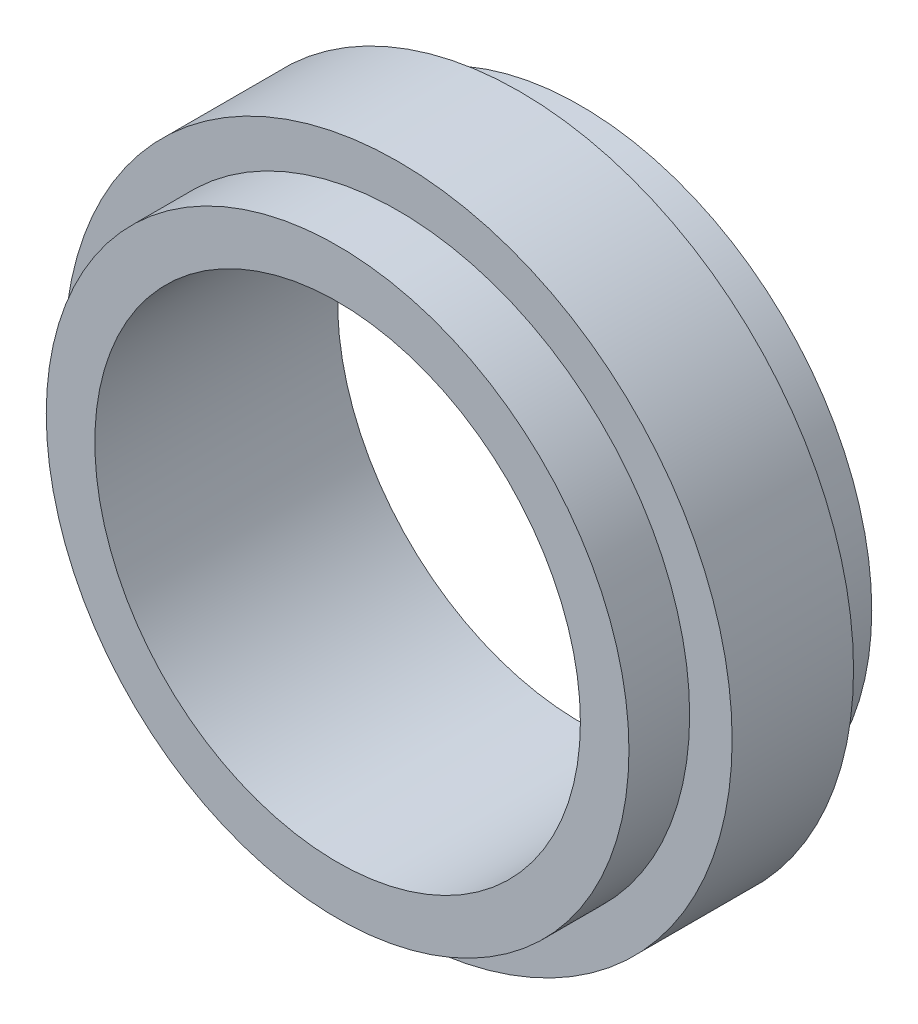
ISO-10303-21;
HEADER;
FILE_DESCRIPTION(('STEP AP214'),'2;1');
FILE_NAME('part.step','',(''),(''),'','','');
FILE_SCHEMA(('AUTOMOTIVE_DESIGN { 1 0 10303 214 1 1 1 1 }'));
ENDSEC;
DATA;
#1=APPLICATION_CONTEXT('core data for automotive mechanical design processes');
#2=APPLICATION_PROTOCOL_DEFINITION('international standard','automotive_design',2000,#1);
#3=PRODUCT_CONTEXT('',#1,'mechanical');
#4=PRODUCT('Part','Part','',(#3));
#5=PRODUCT_RELATED_PRODUCT_CATEGORY('part','',(#4));
#6=PRODUCT_DEFINITION_FORMATION('','',#4);
#7=PRODUCT_DEFINITION_CONTEXT('part definition',#1,'design');
#8=PRODUCT_DEFINITION('design','',#6,#7);
#9=PRODUCT_DEFINITION_SHAPE('','',#8);
#10=(LENGTH_UNIT() NAMED_UNIT(*) SI_UNIT(.MILLI.,.METRE.));
#11=(NAMED_UNIT(*) PLANE_ANGLE_UNIT() SI_UNIT($,.RADIAN.));
#12=(NAMED_UNIT(*) SI_UNIT($,.STERADIAN.) SOLID_ANGLE_UNIT());
#13=UNCERTAINTY_MEASURE_WITH_UNIT(LENGTH_MEASURE(1.E-05),#10,'distance_accuracy_value','');
#14=(GEOMETRIC_REPRESENTATION_CONTEXT(3) GLOBAL_UNCERTAINTY_ASSIGNED_CONTEXT((#13)) GLOBAL_UNIT_ASSIGNED_CONTEXT((#10,
#11,#12)) REPRESENTATION_CONTEXT('',''));
#15=CARTESIAN_POINT('',(0.,0.,0.));
#16=DIRECTION('',(0.,0.,1.));
#17=DIRECTION('',(1.,0.,0.));
#18=AXIS2_PLACEMENT_3D('',#15,#16,#17);
#19=CARTESIAN_POINT('',(0.,0.,5.));
#20=DIRECTION('',(0.,0.,1.));
#21=DIRECTION('',(1.,0.,0.));
#22=AXIS2_PLACEMENT_3D('',#19,#20,#21);
#23=PLANE('',#22);
#24=CARTESIAN_POINT('',(0.,0.,5.));
#25=DIRECTION('',(0.,0.,1.));
#26=DIRECTION('',(1.,0.,0.));
#27=AXIS2_PLACEMENT_3D('',#24,#25,#26);
#28=CIRCLE('',#27,27.5);
#29=CARTESIAN_POINT('',(27.5,0.,5.));
#30=VERTEX_POINT('',#29);
#31=EDGE_CURVE('E10',#30,#30,#28,.T.);
#32=ORIENTED_EDGE('',*,*,#31,.T.);
#33=EDGE_LOOP('',(#32));
#34=FACE_BOUND('',#33,.T.);
#35=CARTESIAN_POINT('',(0.,0.,5.));
#36=DIRECTION('',(0.,0.,1.));
#37=DIRECTION('',(1.,0.,0.));
#38=AXIS2_PLACEMENT_3D('',#35,#36,#37);
#39=CIRCLE('',#38,24.);
#40=CARTESIAN_POINT('',(24.,0.,5.));
#41=VERTEX_POINT('',#40);
#42=EDGE_CURVE('E45',#41,#41,#39,.T.);
#43=ORIENTED_EDGE('',*,*,#42,.F.);
#44=EDGE_LOOP('',(#43));
#45=FACE_BOUND('',#44,.T.);
#46=ADVANCED_FACE('F32',(#34,#45),#23,.T.);
#47=CARTESIAN_POINT('',(0.,0.,-5.));
#48=DIRECTION('',(0.,0.,1.));
#49=DIRECTION('',(1.,0.,0.));
#50=AXIS2_PLACEMENT_3D('',#47,#48,#49);
#51=PLANE('',#50);
#52=CARTESIAN_POINT('',(0.,0.,-5.));
#53=DIRECTION('',(0.,0.,1.));
#54=DIRECTION('',(1.,0.,0.));
#55=AXIS2_PLACEMENT_3D('',#52,#53,#54);
#56=CIRCLE('',#55,24.);
#57=CARTESIAN_POINT('',(24.,0.,-5.));
#58=VERTEX_POINT('',#57);
#59=EDGE_CURVE('E54',#58,#58,#56,.T.);
#60=ORIENTED_EDGE('',*,*,#59,.T.);
#61=EDGE_LOOP('',(#60));
#62=FACE_BOUND('',#61,.T.);
#63=CARTESIAN_POINT('',(0.,0.,-5.));
#64=DIRECTION('',(0.,0.,1.));
#65=DIRECTION('',(1.,0.,0.));
#66=AXIS2_PLACEMENT_3D('',#63,#64,#65);
#67=CIRCLE('',#66,27.5);
#68=CARTESIAN_POINT('',(27.5,0.,-5.));
#69=VERTEX_POINT('',#68);
#70=EDGE_CURVE('E36',#69,#69,#67,.T.);
#71=ORIENTED_EDGE('',*,*,#70,.F.);
#72=EDGE_LOOP('',(#71));
#73=FACE_BOUND('',#72,.T.);
#74=ADVANCED_FACE('F78',(#62,#73),#51,.F.);
#75=CARTESIAN_POINT('',(0.,0.,5.));
#76=DIRECTION('',(0.,0.,-1.));
#77=DIRECTION('',(-1.,0.,0.));
#78=AXIS2_PLACEMENT_3D('',#75,#76,#77);
#79=CYLINDRICAL_SURFACE('',#78,27.5);
#80=ORIENTED_EDGE('',*,*,#31,.F.);
#81=EDGE_LOOP('',(#80));
#82=FACE_BOUND('',#81,.T.);
#83=ORIENTED_EDGE('',*,*,#70,.T.);
#84=EDGE_LOOP('',(#83));
#85=FACE_BOUND('',#84,.T.);
#86=ADVANCED_FACE('F34',(#82,#85),#79,.T.);
#87=CARTESIAN_POINT('',(0.,0.,5.));
#88=DIRECTION('',(0.,0.,-1.));
#89=DIRECTION('',(-1.,0.,0.));
#90=AXIS2_PLACEMENT_3D('',#87,#88,#89);
#91=CYLINDRICAL_SURFACE('',#90,20.);
#92=CARTESIAN_POINT('',(0.,0.,10.));
#93=DIRECTION('',(0.,0.,1.));
#94=DIRECTION('',(1.,0.,0.));
#95=AXIS2_PLACEMENT_3D('',#92,#93,#94);
#96=CIRCLE('',#95,20.);
#97=CARTESIAN_POINT('',(20.,0.,10.));
#98=VERTEX_POINT('',#97);
#99=EDGE_CURVE('E48',#98,#98,#96,.T.);
#100=ORIENTED_EDGE('',*,*,#99,.T.);
#101=EDGE_LOOP('',(#100));
#102=FACE_BOUND('',#101,.T.);
#103=CARTESIAN_POINT('',(0.,0.,-10.));
#104=DIRECTION('',(0.,0.,1.));
#105=DIRECTION('',(1.,0.,0.));
#106=AXIS2_PLACEMENT_3D('',#103,#104,#105);
#107=CIRCLE('',#106,20.);
#108=CARTESIAN_POINT('',(20.,0.,-10.));
#109=VERTEX_POINT('',#108);
#110=EDGE_CURVE('E57',#109,#109,#107,.T.);
#111=ORIENTED_EDGE('',*,*,#110,.F.);
#112=EDGE_LOOP('',(#111));
#113=FACE_BOUND('',#112,.T.);
#114=ADVANCED_FACE('F66',(#102,#113),#91,.F.);
#115=CARTESIAN_POINT('',(0.,0.,10.));
#116=DIRECTION('',(0.,0.,1.));
#117=DIRECTION('',(1.,0.,0.));
#118=AXIS2_PLACEMENT_3D('',#115,#116,#117);
#119=PLANE('',#118);
#120=CARTESIAN_POINT('',(0.,0.,10.));
#121=DIRECTION('',(0.,0.,1.));
#122=DIRECTION('',(1.,0.,0.));
#123=AXIS2_PLACEMENT_3D('',#120,#121,#122);
#124=CIRCLE('',#123,24.);
#125=CARTESIAN_POINT('',(24.,0.,10.));
#126=VERTEX_POINT('',#125);
#127=EDGE_CURVE('E43',#126,#126,#124,.T.);
#128=ORIENTED_EDGE('',*,*,#127,.T.);
#129=EDGE_LOOP('',(#128));
#130=FACE_BOUND('',#129,.T.);
#131=ORIENTED_EDGE('',*,*,#99,.F.);
#132=EDGE_LOOP('',(#131));
#133=FACE_BOUND('',#132,.T.);
#134=ADVANCED_FACE('F68',(#130,#133),#119,.T.);
#135=CARTESIAN_POINT('',(0.,0.,10.));
#136=DIRECTION('',(0.,0.,-1.));
#137=DIRECTION('',(-1.,0.,0.));
#138=AXIS2_PLACEMENT_3D('',#135,#136,#137);
#139=CYLINDRICAL_SURFACE('',#138,24.);
#140=ORIENTED_EDGE('',*,*,#127,.F.);
#141=EDGE_LOOP('',(#140));
#142=FACE_BOUND('',#141,.T.);
#143=ORIENTED_EDGE('',*,*,#42,.T.);
#144=EDGE_LOOP('',(#143));
#145=FACE_BOUND('',#144,.T.);
#146=ADVANCED_FACE('F75',(#142,#145),#139,.T.);
#147=CARTESIAN_POINT('',(0.,0.,-10.));
#148=DIRECTION('',(0.,0.,1.));
#149=DIRECTION('',(1.,0.,0.));
#150=AXIS2_PLACEMENT_3D('',#147,#148,#149);
#151=CYLINDRICAL_SURFACE('',#150,24.);
#152=CARTESIAN_POINT('',(0.,0.,-10.));
#153=DIRECTION('',(0.,0.,1.));
#154=DIRECTION('',(1.,0.,0.));
#155=AXIS2_PLACEMENT_3D('',#152,#153,#154);
#156=CIRCLE('',#155,24.);
#157=CARTESIAN_POINT('',(24.,0.,-10.));
#158=VERTEX_POINT('',#157);
#159=EDGE_CURVE('E53',#158,#158,#156,.T.);
#160=ORIENTED_EDGE('',*,*,#159,.T.);
#161=EDGE_LOOP('',(#160));
#162=FACE_BOUND('',#161,.T.);
#163=ORIENTED_EDGE('',*,*,#59,.F.);
#164=EDGE_LOOP('',(#163));
#165=FACE_BOUND('',#164,.T.);
#166=ADVANCED_FACE('F91',(#162,#165),#151,.T.);
#167=CARTESIAN_POINT('',(0.,0.,-10.));
#168=DIRECTION('',(0.,0.,-1.));
#169=DIRECTION('',(1.,0.,0.));
#170=AXIS2_PLACEMENT_3D('',#167,#168,#169);
#171=PLANE('',#170);
#172=ORIENTED_EDGE('',*,*,#110,.T.);
#173=EDGE_LOOP('',(#172));
#174=FACE_BOUND('',#173,.T.);
#175=ORIENTED_EDGE('',*,*,#159,.F.);
#176=EDGE_LOOP('',(#175));
#177=FACE_BOUND('',#176,.T.);
#178=ADVANCED_FACE('F63',(#174,#177),#171,.T.);
#179=CLOSED_SHELL('',(#46,#74,#86,#114,#134,#146,#166,#178));
#180=MANIFOLD_SOLID_BREP('B2',#179);
#181=ADVANCED_BREP_SHAPE_REPRESENTATION('',(#18,#180),#14);
#182=SHAPE_DEFINITION_REPRESENTATION(#9,#181);
ENDSEC;
END-ISO-10303-21;
